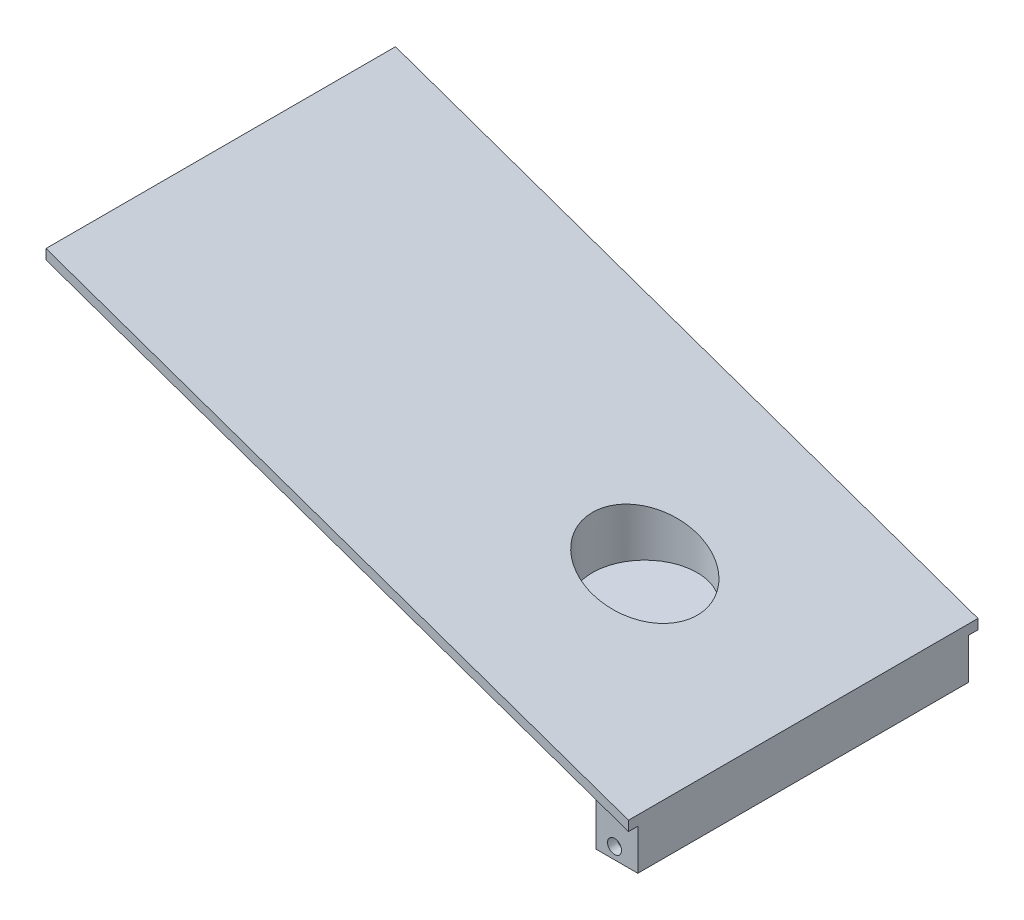
ISO-10303-21;
HEADER;
FILE_DESCRIPTION(('STEP AP214'),'2;1');
FILE_NAME('part.step','',(''),(''),'','','');
FILE_SCHEMA(('AUTOMOTIVE_DESIGN { 1 0 10303 214 1 1 1 1 }'));
ENDSEC;
DATA;
#1=APPLICATION_CONTEXT('core data for automotive mechanical design processes');
#2=APPLICATION_PROTOCOL_DEFINITION('international standard','automotive_design',2000,#1);
#3=PRODUCT_CONTEXT('',#1,'mechanical');
#4=PRODUCT('Part','Part','',(#3));
#5=PRODUCT_RELATED_PRODUCT_CATEGORY('part','',(#4));
#6=PRODUCT_DEFINITION_FORMATION('','',#4);
#7=PRODUCT_DEFINITION_CONTEXT('part definition',#1,'design');
#8=PRODUCT_DEFINITION('design','',#6,#7);
#9=PRODUCT_DEFINITION_SHAPE('','',#8);
#10=(LENGTH_UNIT() NAMED_UNIT(*) SI_UNIT(.MILLI.,.METRE.));
#11=(NAMED_UNIT(*) PLANE_ANGLE_UNIT() SI_UNIT($,.RADIAN.));
#12=(NAMED_UNIT(*) SI_UNIT($,.STERADIAN.) SOLID_ANGLE_UNIT());
#13=UNCERTAINTY_MEASURE_WITH_UNIT(LENGTH_MEASURE(1.E-05),#10,'distance_accuracy_value','');
#14=(GEOMETRIC_REPRESENTATION_CONTEXT(3) GLOBAL_UNCERTAINTY_ASSIGNED_CONTEXT((#13)) GLOBAL_UNIT_ASSIGNED_CONTEXT((#10,
#11,#12)) REPRESENTATION_CONTEXT('',''));
#15=CARTESIAN_POINT('',(0.,0.,0.));
#16=DIRECTION('',(0.,0.,1.));
#17=DIRECTION('',(1.,0.,0.));
#18=AXIS2_PLACEMENT_3D('',#15,#16,#17);
#19=CARTESIAN_POINT('',(-68.,55.,75.));
#20=DIRECTION('',(0.,-1.,0.));
#21=DIRECTION('',(0.,0.,-1.));
#22=AXIS2_PLACEMENT_3D('',#19,#20,#21);
#23=CYLINDRICAL_SURFACE('',#22,26.5);
#24=CARTESIAN_POINT('',(-68.,41.2999547252641,75.));
#25=DIRECTION('',(0.330349663339136,0.943858622851812,0.));
#26=DIRECTION('',(0.943858622851812,-0.330349663339137,0.));
#27=AXIS2_PLACEMENT_3D('',#24,#25,#26);
#28=ELLIPSE('',#27,28.0762387061018,26.5);
#29=CARTESIAN_POINT('',(-41.5,32.0249787208741,75.));
#30=VERTEX_POINT('',#29);
#31=EDGE_CURVE('E11',#30,#30,#28,.F.);
#32=ORIENTED_EDGE('',*,*,#31,.T.);
#33=EDGE_LOOP('',(#32));
#34=FACE_BOUND('',#33,.T.);
#35=CARTESIAN_POINT('',(-68.,27.,75.));
#36=DIRECTION('',(0.,-1.,0.));
#37=DIRECTION('',(0.,0.,-1.));
#38=AXIS2_PLACEMENT_3D('',#35,#36,#37);
#39=CIRCLE('',#38,26.5);
#40=CARTESIAN_POINT('',(-68.,27.,48.5));
#41=VERTEX_POINT('',#40);
#42=EDGE_CURVE('E215',#41,#41,#39,.T.);
#43=ORIENTED_EDGE('',*,*,#42,.F.);
#44=EDGE_LOOP('',(#43));
#45=FACE_BOUND('',#44,.T.);
#46=ADVANCED_FACE('F45',(#34,#45),#23,.T.);
#47=CARTESIAN_POINT('',(-10.,5.,166.));
#48=DIRECTION('',(0.,0.,-1.));
#49=DIRECTION('',(-1.,0.,0.));
#50=AXIS2_PLACEMENT_3D('',#47,#48,#49);
#51=CYLINDRICAL_SURFACE('',#50,3.);
#52=CARTESIAN_POINT('',(-10.,5.,8.00000000000001));
#53=DIRECTION('',(0.,0.,-1.));
#54=DIRECTION('',(0.,1.,0.));
#55=AXIS2_PLACEMENT_3D('',#52,#53,#54);
#56=CIRCLE('',#55,3.);
#57=CARTESIAN_POINT('',(-10.,8.,8.00000000000001));
#58=VERTEX_POINT('',#57);
#59=EDGE_CURVE('E263',#58,#58,#56,.F.);
#60=ORIENTED_EDGE('',*,*,#59,.T.);
#61=EDGE_LOOP('',(#60));
#62=FACE_BOUND('',#61,.T.);
#63=CARTESIAN_POINT('',(-10.,5.,4.));
#64=DIRECTION('',(0.,0.,-1.));
#65=DIRECTION('',(-1.,0.,0.));
#66=AXIS2_PLACEMENT_3D('',#63,#64,#65);
#67=CIRCLE('',#66,3.);
#68=CARTESIAN_POINT('',(-13.,5.,4.));
#69=VERTEX_POINT('',#68);
#70=EDGE_CURVE('E258',#69,#69,#67,.T.);
#71=ORIENTED_EDGE('',*,*,#70,.T.);
#72=EDGE_LOOP('',(#71));
#73=FACE_BOUND('',#72,.T.);
#74=ADVANCED_FACE('F357',(#62,#73),#51,.F.);
#75=CARTESIAN_POINT('',(-18.,0.,150.));
#76=DIRECTION('',(0.,1.,0.));
#77=DIRECTION('',(0.,0.,1.));
#78=AXIS2_PLACEMENT_3D('',#75,#76,#77);
#79=PLANE('',#78);
#80=DIRECTION('',(0.,0.,1.));
#81=VECTOR('',#80,1.);
#82=CARTESIAN_POINT('',(-4.,0.,8.00000000000001));
#83=LINE('',#82,#81);
#84=CARTESIAN_POINT('',(-4.,0.,8.00000000000001));
#85=VERTEX_POINT('',#84);
#86=CARTESIAN_POINT('',(-4.,0.,142.));
#87=VERTEX_POINT('',#86);
#88=EDGE_CURVE('E224',#85,#87,#83,.T.);
#89=ORIENTED_EDGE('',*,*,#88,.F.);
#90=DIRECTION('',(-1.,0.,0.));
#91=VECTOR('',#90,1.);
#92=CARTESIAN_POINT('',(-4.,0.,8.00000000000001));
#93=LINE('',#92,#91);
#94=CARTESIAN_POINT('',(-18.,0.,8.00000000000001));
#95=VERTEX_POINT('',#94);
#96=EDGE_CURVE('E237',#85,#95,#93,.T.);
#97=ORIENTED_EDGE('',*,*,#96,.T.);
#98=DIRECTION('',(0.,0.,-1.));
#99=VECTOR('',#98,1.);
#100=CARTESIAN_POINT('',(-18.,0.,150.));
#101=LINE('',#100,#99);
#102=CARTESIAN_POINT('',(-18.,0.,4.));
#103=VERTEX_POINT('',#102);
#104=EDGE_CURVE('E316',#95,#103,#101,.T.);
#105=ORIENTED_EDGE('',*,*,#104,.T.);
#106=DIRECTION('',(-1.,0.,0.));
#107=VECTOR('',#106,1.);
#108=CARTESIAN_POINT('',(0.,0.,4.));
#109=LINE('',#108,#107);
#110=CARTESIAN_POINT('',(0.,0.,4.));
#111=VERTEX_POINT('',#110);
#112=EDGE_CURVE('E267',#111,#103,#109,.T.);
#113=ORIENTED_EDGE('',*,*,#112,.F.);
#114=DIRECTION('',(0.,0.,-1.));
#115=VECTOR('',#114,1.);
#116=CARTESIAN_POINT('',(0.,0.,150.));
#117=LINE('',#116,#115);
#118=CARTESIAN_POINT('',(0.,0.,146.));
#119=VERTEX_POINT('',#118);
#120=EDGE_CURVE('E55',#119,#111,#117,.T.);
#121=ORIENTED_EDGE('',*,*,#120,.F.);
#122=DIRECTION('',(1.,0.,0.));
#123=VECTOR('',#122,1.);
#124=CARTESIAN_POINT('',(-18.,0.,146.));
#125=LINE('',#124,#123);
#126=CARTESIAN_POINT('',(-18.,0.,146.));
#127=VERTEX_POINT('',#126);
#128=EDGE_CURVE('E289',#127,#119,#125,.T.);
#129=ORIENTED_EDGE('',*,*,#128,.F.);
#130=CARTESIAN_POINT('',(-18.,0.,142.));
#131=VERTEX_POINT('',#130);
#132=EDGE_CURVE('E327',#127,#131,#101,.T.);
#133=ORIENTED_EDGE('',*,*,#132,.T.);
#134=DIRECTION('',(-1.,0.,0.));
#135=VECTOR('',#134,1.);
#136=CARTESIAN_POINT('',(-4.,0.,142.));
#137=LINE('',#136,#135);
#138=EDGE_CURVE('E70',#87,#131,#137,.T.);
#139=ORIENTED_EDGE('',*,*,#138,.F.);
#140=EDGE_LOOP('',(#89,#97,#105,#113,#121,#129,#133,#139));
#141=FACE_BOUND('',#140,.T.);
#142=ADVANCED_FACE('F47',(#141),#79,.F.);
#143=CARTESIAN_POINT('',(-18.,23.8,150.));
#144=DIRECTION('',(1.,0.,0.));
#145=DIRECTION('',(0.,1.,0.));
#146=AXIS2_PLACEMENT_3D('',#143,#144,#145);
#147=PLANE('',#146);
#148=ORIENTED_EDGE('',*,*,#104,.F.);
#149=DIRECTION('',(0.,-1.,0.));
#150=VECTOR('',#149,1.);
#151=CARTESIAN_POINT('',(-18.,0.,8.00000000000001));
#152=LINE('',#151,#150);
#153=CARTESIAN_POINT('',(-18.,17.5,8.));
#154=VERTEX_POINT('',#153);
#155=EDGE_CURVE('E219',#154,#95,#152,.T.);
#156=ORIENTED_EDGE('',*,*,#155,.F.);
#157=DIRECTION('',(0.,0.,-1.));
#158=VECTOR('',#157,1.);
#159=CARTESIAN_POINT('',(-18.,17.5,8.));
#160=LINE('',#159,#158);
#161=CARTESIAN_POINT('',(-18.,17.5,142.));
#162=VERTEX_POINT('',#161);
#163=EDGE_CURVE('E225',#162,#154,#160,.T.);
#164=ORIENTED_EDGE('',*,*,#163,.F.);
#165=DIRECTION('',(0.,1.,0.));
#166=VECTOR('',#165,1.);
#167=CARTESIAN_POINT('',(-18.,0.,142.));
#168=LINE('',#167,#166);
#169=EDGE_CURVE('E240',#131,#162,#168,.T.);
#170=ORIENTED_EDGE('',*,*,#169,.F.);
#171=ORIENTED_EDGE('',*,*,#132,.F.);
#172=DIRECTION('',(0.,-1.,0.));
#173=VECTOR('',#172,1.);
#174=CARTESIAN_POINT('',(-18.,23.8,146.));
#175=LINE('',#174,#173);
#176=CARTESIAN_POINT('',(-18.,23.8,146.));
#177=VERTEX_POINT('',#176);
#178=EDGE_CURVE('E286',#177,#127,#175,.T.);
#179=ORIENTED_EDGE('',*,*,#178,.F.);
#180=DIRECTION('',(0.,0.,-1.));
#181=VECTOR('',#180,1.);
#182=CARTESIAN_POINT('',(-18.,23.8,150.));
#183=LINE('',#182,#181);
#184=CARTESIAN_POINT('',(-18.,23.8,4.));
#185=VERTEX_POINT('',#184);
#186=EDGE_CURVE('E331',#177,#185,#183,.T.);
#187=ORIENTED_EDGE('',*,*,#186,.T.);
#188=DIRECTION('',(0.,1.,0.));
#189=VECTOR('',#188,1.);
#190=CARTESIAN_POINT('',(-18.,0.,4.));
#191=LINE('',#190,#189);
#192=EDGE_CURVE('E271',#103,#185,#191,.T.);
#193=ORIENTED_EDGE('',*,*,#192,.F.);
#194=EDGE_LOOP('',(#148,#156,#164,#170,#171,#179,#187,#193));
#195=FACE_BOUND('',#194,.T.);
#196=ADVANCED_FACE('F401',(#195),#147,.F.);
#197=CARTESIAN_POINT('',(0.,0.,150.));
#198=DIRECTION('',(-1.,0.,0.));
#199=DIRECTION('',(0.,0.,1.));
#200=AXIS2_PLACEMENT_3D('',#197,#198,#199);
#201=PLANE('',#200);
#202=DIRECTION('',(0.,-1.,0.));
#203=VECTOR('',#202,1.);
#204=CARTESIAN_POINT('',(0.,17.5000162989045,4.));
#205=LINE('',#204,#203);
#206=CARTESIAN_POINT('',(0.,17.5000162989045,4.));
#207=VERTEX_POINT('',#206);
#208=EDGE_CURVE('E279',#207,#111,#205,.T.);
#209=ORIENTED_EDGE('',*,*,#208,.F.);
#210=DIRECTION('',(0.,0.,-1.));
#211=VECTOR('',#210,1.);
#212=CARTESIAN_POINT('',(0.,17.5000162989045,4.));
#213=LINE('',#212,#211);
#214=CARTESIAN_POINT('',(0.,17.5000162989045,0.));
#215=VERTEX_POINT('',#214);
#216=EDGE_CURVE('E282',#207,#215,#213,.T.);
#217=ORIENTED_EDGE('',*,*,#216,.T.);
#218=DIRECTION('',(0.,1.,0.));
#219=VECTOR('',#218,1.);
#220=CARTESIAN_POINT('',(0.,0.,0.));
#221=LINE('',#220,#219);
#222=CARTESIAN_POINT('',(0.,21.74,0.));
#223=VERTEX_POINT('',#222);
#224=EDGE_CURVE('E302',#215,#223,#221,.T.);
#225=ORIENTED_EDGE('',*,*,#224,.T.);
#226=DIRECTION('',(0.,0.,-1.));
#227=VECTOR('',#226,1.);
#228=CARTESIAN_POINT('',(0.,21.74,150.));
#229=LINE('',#228,#227);
#230=CARTESIAN_POINT('',(0.,21.74,150.));
#231=VERTEX_POINT('',#230);
#232=EDGE_CURVE('E343',#231,#223,#229,.T.);
#233=ORIENTED_EDGE('',*,*,#232,.F.);
#234=DIRECTION('',(0.,1.,0.));
#235=VECTOR('',#234,1.);
#236=CARTESIAN_POINT('',(0.,0.,150.));
#237=LINE('',#236,#235);
#238=CARTESIAN_POINT('',(0.,17.5000162989045,150.));
#239=VERTEX_POINT('',#238);
#240=EDGE_CURVE('E303',#239,#231,#237,.T.);
#241=ORIENTED_EDGE('',*,*,#240,.F.);
#242=DIRECTION('',(0.,0.,1.));
#243=VECTOR('',#242,1.);
#244=CARTESIAN_POINT('',(0.,17.5000162989045,146.));
#245=LINE('',#244,#243);
#246=CARTESIAN_POINT('',(0.,17.5000162989045,146.));
#247=VERTEX_POINT('',#246);
#248=EDGE_CURVE('E298',#247,#239,#245,.T.);
#249=ORIENTED_EDGE('',*,*,#248,.F.);
#250=DIRECTION('',(0.,1.,0.));
#251=VECTOR('',#250,1.);
#252=CARTESIAN_POINT('',(0.,0.,146.));
#253=LINE('',#252,#251);
#254=EDGE_CURVE('E292',#119,#247,#253,.T.);
#255=ORIENTED_EDGE('',*,*,#254,.F.);
#256=ORIENTED_EDGE('',*,*,#120,.T.);
#257=EDGE_LOOP('',(#209,#217,#225,#233,#241,#249,#255,#256));
#258=FACE_BOUND('',#257,.T.);
#259=ADVANCED_FACE('F418',(#258),#201,.F.);
#260=CARTESIAN_POINT('',(0.,21.74,150.));
#261=DIRECTION('',(-0.330349663339136,-0.943858622851812,0.));
#262=DIRECTION('',(0.943858622851812,-0.330349663339136,0.));
#263=AXIS2_PLACEMENT_3D('',#260,#261,#262);
#264=PLANE('',#263);
#265=CARTESIAN_POINT('',(-68.,45.5399384263591,75.));
#266=DIRECTION('',(0.330349663339136,0.943858622851812,0.));
#267=DIRECTION('',(-0.943858622851812,0.330349663339136,0.));
#268=AXIS2_PLACEMENT_3D('',#265,#266,#267);
#269=ELLIPSE('',#268,23.8383158825393,22.5);
#270=CARTESIAN_POINT('',(-90.5,53.414918052728,75.));
#271=VERTEX_POINT('',#270);
#272=EDGE_CURVE('E49',#271,#271,#269,.F.);
#273=ORIENTED_EDGE('',*,*,#272,.T.);
#274=EDGE_LOOP('',(#273));
#275=FACE_BOUND('',#274,.T.);
#276=DIRECTION('',(-0.943858622851812,0.330349663339136,0.));
#277=VECTOR('',#276,1.);
#278=CARTESIAN_POINT('',(0.,21.74,0.));
#279=LINE('',#278,#277);
#280=CARTESIAN_POINT('',(-249.999833434758,109.239715328637,0.));
#281=VERTEX_POINT('',#280);
#282=EDGE_CURVE('E319',#223,#281,#279,.T.);
#283=ORIENTED_EDGE('',*,*,#282,.T.);
#284=DIRECTION('',(0.,0.,-1.));
#285=VECTOR('',#284,1.);
#286=CARTESIAN_POINT('',(-249.999833434758,109.239715328637,150.));
#287=LINE('',#286,#285);
#288=CARTESIAN_POINT('',(-249.999833434758,109.239715328637,150.));
#289=VERTEX_POINT('',#288);
#290=EDGE_CURVE('E339',#289,#281,#287,.T.);
#291=ORIENTED_EDGE('',*,*,#290,.F.);
#292=DIRECTION('',(-0.943858622851812,0.330349663339136,0.));
#293=VECTOR('',#292,1.);
#294=CARTESIAN_POINT('',(0.,21.74,150.));
#295=LINE('',#294,#293);
#296=EDGE_CURVE('E306',#231,#289,#295,.T.);
#297=ORIENTED_EDGE('',*,*,#296,.F.);
#298=ORIENTED_EDGE('',*,*,#232,.T.);
#299=EDGE_LOOP('',(#283,#291,#297,#298));
#300=FACE_BOUND('',#299,.T.);
#301=ADVANCED_FACE('F434',(#275,#300),#264,.F.);
#302=CARTESIAN_POINT('',(-249.999833434758,109.239715328637,150.));
#303=DIRECTION('',(1.,-2.61846059535218E-13,0.));
#304=DIRECTION('',(2.61846059535218E-13,1.,0.));
#305=AXIS2_PLACEMENT_3D('',#302,#303,#304);
#306=PLANE('',#305);
#307=DIRECTION('',(-2.61846059535218E-13,-1.,0.));
#308=VECTOR('',#307,1.);
#309=CARTESIAN_POINT('',(-249.999833434758,109.239715328637,0.));
#310=LINE('',#309,#308);
#311=CARTESIAN_POINT('',(-249.999833434759,104.999731627542,0.));
#312=VERTEX_POINT('',#311);
#313=EDGE_CURVE('E322',#281,#312,#310,.T.);
#314=ORIENTED_EDGE('',*,*,#313,.T.);
#315=DIRECTION('',(0.,0.,-1.));
#316=VECTOR('',#315,1.);
#317=CARTESIAN_POINT('',(-249.999833434759,104.999731627542,150.));
#318=LINE('',#317,#316);
#319=CARTESIAN_POINT('',(-249.999833434759,104.999731627542,150.));
#320=VERTEX_POINT('',#319);
#321=EDGE_CURVE('E335',#320,#312,#318,.T.);
#322=ORIENTED_EDGE('',*,*,#321,.F.);
#323=DIRECTION('',(-2.61846059535218E-13,-1.,0.));
#324=VECTOR('',#323,1.);
#325=CARTESIAN_POINT('',(-249.999833434758,109.239715328637,150.));
#326=LINE('',#325,#324);
#327=EDGE_CURVE('E310',#289,#320,#326,.T.);
#328=ORIENTED_EDGE('',*,*,#327,.F.);
#329=ORIENTED_EDGE('',*,*,#290,.T.);
#330=EDGE_LOOP('',(#314,#322,#328,#329));
#331=FACE_BOUND('',#330,.T.);
#332=ADVANCED_FACE('F438',(#331),#306,.F.);
#333=CARTESIAN_POINT('',(-249.999833434759,104.999731627542,150.));
#334=DIRECTION('',(0.330349663339136,0.943858622851812,0.));
#335=DIRECTION('',(-0.943858622851812,0.330349663339137,0.));
#336=AXIS2_PLACEMENT_3D('',#333,#334,#335);
#337=PLANE('',#336);
#338=DIRECTION('',(0.943858622851812,-0.330349663339136,0.));
#339=VECTOR('',#338,1.);
#340=CARTESIAN_POINT('',(-246.224398943352,103.678332974186,4.));
#341=LINE('',#340,#339);
#342=CARTESIAN_POINT('',(-246.224398943352,103.678332974185,4.));
#343=VERTEX_POINT('',#342);
#344=CARTESIAN_POINT('',(-184.873588457984,82.2056048571416,4.));
#345=VERTEX_POINT('',#344);
#346=EDGE_CURVE('E197',#343,#345,#341,.T.);
#347=ORIENTED_EDGE('',*,*,#346,.F.);
#348=DIRECTION('',(0.,0.,-1.));
#349=VECTOR('',#348,1.);
#350=CARTESIAN_POINT('',(-246.224398943352,103.678332974186,4.));
#351=LINE('',#350,#349);
#352=CARTESIAN_POINT('',(-246.224398943352,103.678332974186,146.));
#353=VERTEX_POINT('',#352);
#354=EDGE_CURVE('E62',#353,#343,#351,.T.);
#355=ORIENTED_EDGE('',*,*,#354,.F.);
#356=DIRECTION('',(-0.943858622851812,0.330349663339136,0.));
#357=VECTOR('',#356,1.);
#358=CARTESIAN_POINT('',(-246.224398943352,103.678332974186,146.));
#359=LINE('',#358,#357);
#360=CARTESIAN_POINT('',(-184.873588457984,82.2056048571416,146.));
#361=VERTEX_POINT('',#360);
#362=EDGE_CURVE('E184',#361,#353,#359,.T.);
#363=ORIENTED_EDGE('',*,*,#362,.F.);
#364=DIRECTION('',(0.,0.,1.));
#365=VECTOR('',#364,1.);
#366=CARTESIAN_POINT('',(-184.873588457984,82.2056048571416,4.));
#367=LINE('',#366,#365);
#368=EDGE_CURVE('E188',#345,#361,#367,.T.);
#369=ORIENTED_EDGE('',*,*,#368,.F.);
#370=EDGE_LOOP('',(#347,#355,#363,#369));
#371=FACE_BOUND('',#370,.T.);
#372=ORIENTED_EDGE('',*,*,#31,.F.);
#373=EDGE_LOOP('',(#372));
#374=FACE_BOUND('',#373,.T.);
#375=DIRECTION('',(0.943858622851812,-0.330349663339136,0.));
#376=VECTOR('',#375,1.);
#377=CARTESIAN_POINT('',(-249.999833434759,104.999731627542,0.));
#378=LINE('',#377,#376);
#379=EDGE_CURVE('E307',#312,#215,#378,.T.);
#380=ORIENTED_EDGE('',*,*,#379,.T.);
#381=ORIENTED_EDGE('',*,*,#216,.F.);
#382=DIRECTION('',(0.943858622851805,-0.330349663339156,0.));
#383=VECTOR('',#382,1.);
#384=CARTESIAN_POINT('',(-18.,23.8,4.));
#385=LINE('',#384,#383);
#386=EDGE_CURVE('E275',#185,#207,#385,.T.);
#387=ORIENTED_EDGE('',*,*,#386,.F.);
#388=ORIENTED_EDGE('',*,*,#186,.F.);
#389=DIRECTION('',(-0.943858622851805,0.330349663339156,0.));
#390=VECTOR('',#389,1.);
#391=CARTESIAN_POINT('',(-18.,23.8,146.));
#392=LINE('',#391,#390);
#393=EDGE_CURVE('E295',#247,#177,#392,.T.);
#394=ORIENTED_EDGE('',*,*,#393,.F.);
#395=ORIENTED_EDGE('',*,*,#248,.T.);
#396=DIRECTION('',(0.943858622851812,-0.330349663339136,0.));
#397=VECTOR('',#396,1.);
#398=CARTESIAN_POINT('',(-249.999833434759,104.999731627542,150.));
#399=LINE('',#398,#397);
#400=EDGE_CURVE('E313',#320,#239,#399,.T.);
#401=ORIENTED_EDGE('',*,*,#400,.F.);
#402=ORIENTED_EDGE('',*,*,#321,.T.);
#403=EDGE_LOOP('',(#380,#381,#387,#388,#394,#395,#401,#402));
#404=FACE_BOUND('',#403,.T.);
#405=ADVANCED_FACE('F423',(#371,#374,#404),#337,.F.);
#406=CARTESIAN_POINT('',(0.,0.,150.));
#407=DIRECTION('',(0.,0.,1.));
#408=DIRECTION('',(1.,0.,0.));
#409=AXIS2_PLACEMENT_3D('',#406,#407,#408);
#410=PLANE('',#409);
#411=ORIENTED_EDGE('',*,*,#400,.T.);
#412=ORIENTED_EDGE('',*,*,#240,.T.);
#413=ORIENTED_EDGE('',*,*,#296,.T.);
#414=ORIENTED_EDGE('',*,*,#327,.T.);
#415=EDGE_LOOP('',(#411,#412,#413,#414));
#416=FACE_BOUND('',#415,.T.);
#417=ADVANCED_FACE('F441',(#416),#410,.T.);
#418=CARTESIAN_POINT('',(0.,0.,0.));
#419=DIRECTION('',(0.,0.,1.));
#420=DIRECTION('',(1.,0.,0.));
#421=AXIS2_PLACEMENT_3D('',#418,#419,#420);
#422=PLANE('',#421);
#423=ORIENTED_EDGE('',*,*,#224,.F.);
#424=ORIENTED_EDGE('',*,*,#379,.F.);
#425=ORIENTED_EDGE('',*,*,#313,.F.);
#426=ORIENTED_EDGE('',*,*,#282,.F.);
#427=EDGE_LOOP('',(#423,#424,#425,#426));
#428=FACE_BOUND('',#427,.T.);
#429=ADVANCED_FACE('F430',(#428),#422,.F.);
#430=CARTESIAN_POINT('',(0.,0.,146.));
#431=DIRECTION('',(0.,0.,1.));
#432=DIRECTION('',(1.,0.,0.));
#433=AXIS2_PLACEMENT_3D('',#430,#431,#432);
#434=PLANE('',#433);
#435=CARTESIAN_POINT('',(-10.,5.,146.));
#436=DIRECTION('',(0.,0.,1.));
#437=DIRECTION('',(1.,0.,0.));
#438=AXIS2_PLACEMENT_3D('',#435,#436,#437);
#439=CIRCLE('',#438,3.);
#440=CARTESIAN_POINT('',(-7.,5.,146.));
#441=VERTEX_POINT('',#440);
#442=EDGE_CURVE('E262',#441,#441,#439,.T.);
#443=ORIENTED_EDGE('',*,*,#442,.F.);
#444=EDGE_LOOP('',(#443));
#445=FACE_BOUND('',#444,.T.);
#446=ORIENTED_EDGE('',*,*,#178,.T.);
#447=ORIENTED_EDGE('',*,*,#128,.T.);
#448=ORIENTED_EDGE('',*,*,#254,.T.);
#449=ORIENTED_EDGE('',*,*,#393,.T.);
#450=EDGE_LOOP('',(#446,#447,#448,#449));
#451=FACE_BOUND('',#450,.T.);
#452=ADVANCED_FACE('F413',(#445,#451),#434,.T.);
#453=CARTESIAN_POINT('',(0.,0.,4.));
#454=DIRECTION('',(0.,0.,-1.));
#455=DIRECTION('',(-1.,0.,0.));
#456=AXIS2_PLACEMENT_3D('',#453,#454,#455);
#457=PLANE('',#456);
#458=ORIENTED_EDGE('',*,*,#70,.F.);
#459=EDGE_LOOP('',(#458));
#460=FACE_BOUND('',#459,.T.);
#461=ORIENTED_EDGE('',*,*,#112,.T.);
#462=ORIENTED_EDGE('',*,*,#192,.T.);
#463=ORIENTED_EDGE('',*,*,#386,.T.);
#464=ORIENTED_EDGE('',*,*,#208,.T.);
#465=EDGE_LOOP('',(#461,#462,#463,#464));
#466=FACE_BOUND('',#465,.T.);
#467=ADVANCED_FACE('F372',(#460,#466),#457,.T.);
#468=CARTESIAN_POINT('',(-10.,5.,142.));
#469=DIRECTION('',(0.,0.,1.));
#470=DIRECTION('',(1.,0.,0.));
#471=AXIS2_PLACEMENT_3D('',#468,#469,#470);
#472=CIRCLE('',#471,3.);
#473=CARTESIAN_POINT('',(-7.,5.,142.));
#474=VERTEX_POINT('',#473);
#475=EDGE_CURVE('E249',#474,#474,#472,.F.);
#476=ORIENTED_EDGE('',*,*,#475,.T.);
#477=EDGE_LOOP('',(#476));
#478=FACE_BOUND('',#477,.T.);
#479=ORIENTED_EDGE('',*,*,#442,.T.);
#480=EDGE_LOOP('',(#479));
#481=FACE_BOUND('',#480,.T.);
#482=ADVANCED_FACE('F363',(#478,#481),#51,.F.);
#483=CARTESIAN_POINT('',(-4.,0.,8.00000000000001));
#484=DIRECTION('',(0.,0.,-1.));
#485=DIRECTION('',(0.,1.,0.));
#486=AXIS2_PLACEMENT_3D('',#483,#484,#485);
#487=PLANE('',#486);
#488=ORIENTED_EDGE('',*,*,#155,.T.);
#489=ORIENTED_EDGE('',*,*,#96,.F.);
#490=DIRECTION('',(0.,-1.,0.));
#491=VECTOR('',#490,1.);
#492=CARTESIAN_POINT('',(-4.,0.,8.00000000000001));
#493=LINE('',#492,#491);
#494=CARTESIAN_POINT('',(-4.,17.5,8.));
#495=VERTEX_POINT('',#494);
#496=EDGE_CURVE('E220',#495,#85,#493,.T.);
#497=ORIENTED_EDGE('',*,*,#496,.F.);
#498=DIRECTION('',(-1.,0.,0.));
#499=VECTOR('',#498,1.);
#500=CARTESIAN_POINT('',(-4.,17.5,8.));
#501=LINE('',#500,#499);
#502=EDGE_CURVE('E246',#495,#154,#501,.T.);
#503=ORIENTED_EDGE('',*,*,#502,.T.);
#504=EDGE_LOOP('',(#488,#489,#497,#503));
#505=FACE_BOUND('',#504,.T.);
#506=ORIENTED_EDGE('',*,*,#59,.F.);
#507=EDGE_LOOP('',(#506));
#508=FACE_BOUND('',#507,.T.);
#509=ADVANCED_FACE('F360',(#505,#508),#487,.F.);
#510=CARTESIAN_POINT('',(-4.,0.,142.));
#511=DIRECTION('',(0.,0.,1.));
#512=DIRECTION('',(1.,0.,0.));
#513=AXIS2_PLACEMENT_3D('',#510,#511,#512);
#514=PLANE('',#513);
#515=ORIENTED_EDGE('',*,*,#169,.T.);
#516=DIRECTION('',(-1.,0.,0.));
#517=VECTOR('',#516,1.);
#518=CARTESIAN_POINT('',(-4.,17.5,142.));
#519=LINE('',#518,#517);
#520=CARTESIAN_POINT('',(-4.,17.5,142.));
#521=VERTEX_POINT('',#520);
#522=EDGE_CURVE('E250',#521,#162,#519,.T.);
#523=ORIENTED_EDGE('',*,*,#522,.F.);
#524=DIRECTION('',(0.,1.,0.));
#525=VECTOR('',#524,1.);
#526=CARTESIAN_POINT('',(-4.,0.,142.));
#527=LINE('',#526,#525);
#528=EDGE_CURVE('E229',#87,#521,#527,.T.);
#529=ORIENTED_EDGE('',*,*,#528,.F.);
#530=ORIENTED_EDGE('',*,*,#138,.T.);
#531=EDGE_LOOP('',(#515,#523,#529,#530));
#532=FACE_BOUND('',#531,.T.);
#533=ORIENTED_EDGE('',*,*,#475,.F.);
#534=EDGE_LOOP('',(#533));
#535=FACE_BOUND('',#534,.T.);
#536=ADVANCED_FACE('F362',(#532,#535),#514,.F.);
#537=CARTESIAN_POINT('',(-4.,17.5,8.));
#538=DIRECTION('',(0.,1.,0.));
#539=DIRECTION('',(-1.,0.,0.));
#540=AXIS2_PLACEMENT_3D('',#537,#538,#539);
#541=PLANE('',#540);
#542=ORIENTED_EDGE('',*,*,#163,.T.);
#543=ORIENTED_EDGE('',*,*,#502,.F.);
#544=DIRECTION('',(0.,0.,-1.));
#545=VECTOR('',#544,1.);
#546=CARTESIAN_POINT('',(-4.,17.5,8.));
#547=LINE('',#546,#545);
#548=EDGE_CURVE('E233',#521,#495,#547,.T.);
#549=ORIENTED_EDGE('',*,*,#548,.F.);
#550=ORIENTED_EDGE('',*,*,#522,.T.);
#551=EDGE_LOOP('',(#542,#543,#549,#550));
#552=FACE_BOUND('',#551,.T.);
#553=ADVANCED_FACE('F370',(#552),#541,.F.);
#554=CARTESIAN_POINT('',(-4.,0.,0.));
#555=DIRECTION('',(1.,0.,0.));
#556=DIRECTION('',(0.,1.,0.));
#557=AXIS2_PLACEMENT_3D('',#554,#555,#556);
#558=PLANE('',#557);
#559=ORIENTED_EDGE('',*,*,#496,.T.);
#560=ORIENTED_EDGE('',*,*,#88,.T.);
#561=ORIENTED_EDGE('',*,*,#528,.T.);
#562=ORIENTED_EDGE('',*,*,#548,.T.);
#563=EDGE_LOOP('',(#559,#560,#561,#562));
#564=FACE_BOUND('',#563,.T.);
#565=ADVANCED_FACE('F388',(#564),#558,.F.);
#566=CARTESIAN_POINT('',(-68.,27.,75.));
#567=DIRECTION('',(0.,-1.,0.));
#568=DIRECTION('',(0.,0.,-1.));
#569=AXIS2_PLACEMENT_3D('',#566,#567,#568);
#570=PLANE('',#569);
#571=ORIENTED_EDGE('',*,*,#42,.T.);
#572=EDGE_LOOP('',(#571));
#573=FACE_BOUND('',#572,.T.);
#574=ADVANCED_FACE('F386',(#573),#570,.T.);
#575=CARTESIAN_POINT('',(-245.563699616674,105.566050219889,4.));
#576=DIRECTION('',(-0.943858622851812,0.330349663339137,0.));
#577=DIRECTION('',(-0.330349663339137,-0.943858622851812,0.));
#578=AXIS2_PLACEMENT_3D('',#575,#576,#577);
#579=PLANE('',#578);
#580=ORIENTED_EDGE('',*,*,#354,.T.);
#581=DIRECTION('',(-0.330349663339137,-0.943858622851812,0.));
#582=VECTOR('',#581,1.);
#583=CARTESIAN_POINT('',(-245.563699616674,105.566050219889,4.));
#584=LINE('',#583,#582);
#585=CARTESIAN_POINT('',(-245.563699616674,105.566050219889,4.));
#586=VERTEX_POINT('',#585);
#587=EDGE_CURVE('E159',#586,#343,#584,.T.);
#588=ORIENTED_EDGE('',*,*,#587,.F.);
#589=DIRECTION('',(0.,0.,-1.));
#590=VECTOR('',#589,1.);
#591=CARTESIAN_POINT('',(-245.563699616674,105.566050219889,4.));
#592=LINE('',#591,#590);
#593=CARTESIAN_POINT('',(-245.563699616674,105.566050219889,146.));
#594=VERTEX_POINT('',#593);
#595=EDGE_CURVE('E163',#594,#586,#592,.T.);
#596=ORIENTED_EDGE('',*,*,#595,.F.);
#597=DIRECTION('',(-0.330349663339137,-0.943858622851812,0.));
#598=VECTOR('',#597,1.);
#599=CARTESIAN_POINT('',(-245.563699616674,105.566050219889,146.));
#600=LINE('',#599,#598);
#601=EDGE_CURVE('E203',#594,#353,#600,.T.);
#602=ORIENTED_EDGE('',*,*,#601,.T.);
#603=EDGE_LOOP('',(#580,#588,#596,#602));
#604=FACE_BOUND('',#603,.T.);
#605=ADVANCED_FACE('F161',(#604),#579,.F.);
#606=CARTESIAN_POINT('',(-245.563699616674,105.566050219889,146.));
#607=DIRECTION('',(0.,0.,1.));
#608=DIRECTION('',(1.,0.,0.));
#609=AXIS2_PLACEMENT_3D('',#606,#607,#608);
#610=PLANE('',#609);
#611=ORIENTED_EDGE('',*,*,#362,.T.);
#612=ORIENTED_EDGE('',*,*,#601,.F.);
#613=DIRECTION('',(-0.943858622851812,0.330349663339136,0.));
#614=VECTOR('',#613,1.);
#615=CARTESIAN_POINT('',(-245.563699616674,105.566050219889,146.));
#616=LINE('',#615,#614);
#617=CARTESIAN_POINT('',(-184.212889131306,84.0933221028453,146.));
#618=VERTEX_POINT('',#617);
#619=EDGE_CURVE('E170',#618,#594,#616,.T.);
#620=ORIENTED_EDGE('',*,*,#619,.F.);
#621=DIRECTION('',(-0.330349663339137,-0.943858622851812,0.));
#622=VECTOR('',#621,1.);
#623=CARTESIAN_POINT('',(-184.212889131306,84.0933221028453,146.));
#624=LINE('',#623,#622);
#625=EDGE_CURVE('E207',#618,#361,#624,.T.);
#626=ORIENTED_EDGE('',*,*,#625,.T.);
#627=EDGE_LOOP('',(#611,#612,#620,#626));
#628=FACE_BOUND('',#627,.T.);
#629=ADVANCED_FACE('F559',(#628),#610,.F.);
#630=CARTESIAN_POINT('',(-184.212889131306,84.0933221028453,4.));
#631=DIRECTION('',(0.943858622851812,-0.330349663339137,0.));
#632=DIRECTION('',(0.330349663339137,0.943858622851812,0.));
#633=AXIS2_PLACEMENT_3D('',#630,#631,#632);
#634=PLANE('',#633);
#635=ORIENTED_EDGE('',*,*,#368,.T.);
#636=ORIENTED_EDGE('',*,*,#625,.F.);
#637=DIRECTION('',(0.,0.,1.));
#638=VECTOR('',#637,1.);
#639=CARTESIAN_POINT('',(-184.212889131306,84.0933221028453,4.));
#640=LINE('',#639,#638);
#641=CARTESIAN_POINT('',(-184.212889131306,84.0933221028453,4.));
#642=VERTEX_POINT('',#641);
#643=EDGE_CURVE('E179',#642,#618,#640,.T.);
#644=ORIENTED_EDGE('',*,*,#643,.F.);
#645=DIRECTION('',(-0.330349663339137,-0.943858622851812,0.));
#646=VECTOR('',#645,1.);
#647=CARTESIAN_POINT('',(-184.212889131306,84.0933221028453,4.));
#648=LINE('',#647,#646);
#649=EDGE_CURVE('E169',#642,#345,#648,.T.);
#650=ORIENTED_EDGE('',*,*,#649,.T.);
#651=EDGE_LOOP('',(#635,#636,#644,#650));
#652=FACE_BOUND('',#651,.T.);
#653=ADVANCED_FACE('F568',(#652),#634,.F.);
#654=CARTESIAN_POINT('',(-245.563699616674,105.566050219889,4.));
#655=DIRECTION('',(0.,0.,-1.));
#656=DIRECTION('',(-1.,0.,0.));
#657=AXIS2_PLACEMENT_3D('',#654,#655,#656);
#658=PLANE('',#657);
#659=ORIENTED_EDGE('',*,*,#346,.T.);
#660=ORIENTED_EDGE('',*,*,#649,.F.);
#661=DIRECTION('',(0.943858622851812,-0.330349663339136,0.));
#662=VECTOR('',#661,1.);
#663=CARTESIAN_POINT('',(-245.563699616674,105.566050219889,4.));
#664=LINE('',#663,#662);
#665=EDGE_CURVE('E173',#586,#642,#664,.T.);
#666=ORIENTED_EDGE('',*,*,#665,.F.);
#667=ORIENTED_EDGE('',*,*,#587,.T.);
#668=EDGE_LOOP('',(#659,#660,#666,#667));
#669=FACE_BOUND('',#668,.T.);
#670=ADVANCED_FACE('F174',(#669),#658,.F.);
#671=CARTESIAN_POINT('',(6.11726352896156,17.4779410146995,0.));
#672=DIRECTION('',(0.330349663339136,0.943858622851812,0.));
#673=DIRECTION('',(-0.943858622851812,0.330349663339136,0.));
#674=AXIS2_PLACEMENT_3D('',#671,#672,#673);
#675=PLANE('',#674);
#676=ORIENTED_EDGE('',*,*,#595,.T.);
#677=ORIENTED_EDGE('',*,*,#665,.T.);
#678=ORIENTED_EDGE('',*,*,#643,.T.);
#679=ORIENTED_EDGE('',*,*,#619,.T.);
#680=EDGE_LOOP('',(#676,#677,#678,#679));
#681=FACE_BOUND('',#680,.T.);
#682=ADVANCED_FACE('F181',(#681),#675,.F.);
#683=CARTESIAN_POINT('',(-68.,31.,75.));
#684=DIRECTION('',(0.,1.,0.));
#685=DIRECTION('',(0.,0.,1.));
#686=AXIS2_PLACEMENT_3D('',#683,#684,#685);
#687=PLANE('',#686);
#688=CARTESIAN_POINT('',(-68.,31.,75.));
#689=DIRECTION('',(0.,1.,0.));
#690=DIRECTION('',(0.,0.,1.));
#691=AXIS2_PLACEMENT_3D('',#688,#689,#690);
#692=CIRCLE('',#691,22.5);
#693=CARTESIAN_POINT('',(-68.,31.,97.5));
#694=VERTEX_POINT('',#693);
#695=EDGE_CURVE('E206',#694,#694,#692,.T.);
#696=ORIENTED_EDGE('',*,*,#695,.T.);
#697=EDGE_LOOP('',(#696));
#698=FACE_BOUND('',#697,.T.);
#699=ADVANCED_FACE('F545',(#698),#687,.T.);
#700=CARTESIAN_POINT('',(-68.,31.,75.));
#701=DIRECTION('',(0.,1.,0.));
#702=DIRECTION('',(0.,0.,1.));
#703=AXIS2_PLACEMENT_3D('',#700,#701,#702);
#704=CYLINDRICAL_SURFACE('',#703,22.5);
#705=ORIENTED_EDGE('',*,*,#695,.F.);
#706=EDGE_LOOP('',(#705));
#707=FACE_BOUND('',#706,.T.);
#708=ORIENTED_EDGE('',*,*,#272,.F.);
#709=EDGE_LOOP('',(#708));
#710=FACE_BOUND('',#709,.T.);
#711=ADVANCED_FACE('F549',(#707,#710),#704,.F.);
#712=CLOSED_SHELL('',(#46,#74,#142,#196,#259,#301,#332,#405,#417,#429,#452,#467,#482,#509,#536,
#553,#565,#574,#605,#629,#653,#670,#682,#699,#711));
#713=MANIFOLD_SOLID_BREP('B2',#712);
#714=ADVANCED_BREP_SHAPE_REPRESENTATION('',(#18,#713),#14);
#715=SHAPE_DEFINITION_REPRESENTATION(#9,#714);
ENDSEC;
END-ISO-10303-21;
